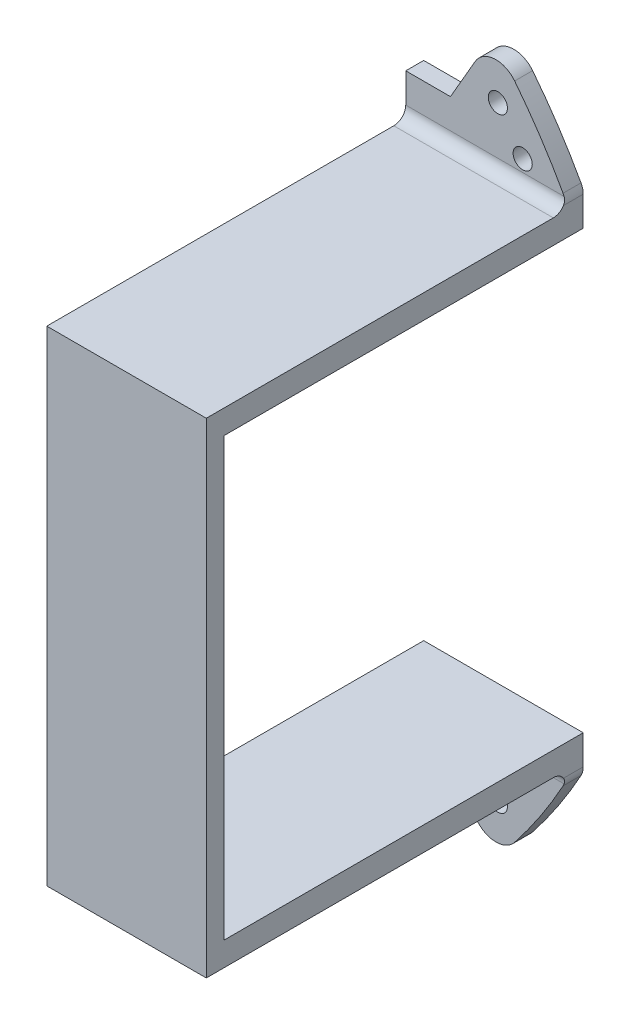
ISO-10303-21;
HEADER;
FILE_DESCRIPTION(('STEP AP214'),'2;1');
FILE_NAME('part.step','',(''),(''),'','','');
FILE_SCHEMA(('AUTOMOTIVE_DESIGN { 1 0 10303 214 1 1 1 1 }'));
ENDSEC;
DATA;
#1=APPLICATION_CONTEXT('core data for automotive mechanical design processes');
#2=APPLICATION_PROTOCOL_DEFINITION('international standard','automotive_design',2000,#1);
#3=PRODUCT_CONTEXT('',#1,'mechanical');
#4=PRODUCT('Part','Part','',(#3));
#5=PRODUCT_RELATED_PRODUCT_CATEGORY('part','',(#4));
#6=PRODUCT_DEFINITION_FORMATION('','',#4);
#7=PRODUCT_DEFINITION_CONTEXT('part definition',#1,'design');
#8=PRODUCT_DEFINITION('design','',#6,#7);
#9=PRODUCT_DEFINITION_SHAPE('','',#8);
#10=(LENGTH_UNIT() NAMED_UNIT(*) SI_UNIT(.MILLI.,.METRE.));
#11=(NAMED_UNIT(*) PLANE_ANGLE_UNIT() SI_UNIT($,.RADIAN.));
#12=(NAMED_UNIT(*) SI_UNIT($,.STERADIAN.) SOLID_ANGLE_UNIT());
#13=UNCERTAINTY_MEASURE_WITH_UNIT(LENGTH_MEASURE(1.E-05),#10,'distance_accuracy_value','');
#14=(GEOMETRIC_REPRESENTATION_CONTEXT(3) GLOBAL_UNCERTAINTY_ASSIGNED_CONTEXT((#13)) GLOBAL_UNIT_ASSIGNED_CONTEXT((#10,
#11,#12)) REPRESENTATION_CONTEXT('',''));
#15=CARTESIAN_POINT('',(0.,0.,0.));
#16=DIRECTION('',(0.,0.,1.));
#17=DIRECTION('',(1.,0.,0.));
#18=AXIS2_PLACEMENT_3D('',#15,#16,#17);
#19=CARTESIAN_POINT('',(0.,0.,60.));
#20=DIRECTION('',(0.,0.,1.));
#21=DIRECTION('',(1.,0.,0.));
#22=AXIS2_PLACEMENT_3D('',#19,#20,#21);
#23=PLANE('',#22);
#24=DIRECTION('',(1.,0.,0.));
#25=VECTOR('',#24,1.);
#26=CARTESIAN_POINT('',(51.6911061384803,36.5132181955899,60.));
#27=LINE('',#26,#25);
#28=CARTESIAN_POINT('',(51.6911061384803,36.5132181955899,60.));
#29=VERTEX_POINT('',#28);
#30=CARTESIAN_POINT('',(78.3533880105422,36.5132181955899,60.));
#31=VERTEX_POINT('',#30);
#32=EDGE_CURVE('E249',#29,#31,#27,.T.);
#33=ORIENTED_EDGE('',*,*,#32,.T.);
#34=DIRECTION('',(0.,1.,0.));
#35=VECTOR('',#34,1.);
#36=CARTESIAN_POINT('',(78.3533880105423,40.5132181955899,60.));
#37=LINE('',#36,#35);
#38=CARTESIAN_POINT('',(78.3533880105422,-36.5132181955899,60.));
#39=VERTEX_POINT('',#38);
#40=EDGE_CURVE('E262',#39,#31,#37,.T.);
#41=ORIENTED_EDGE('',*,*,#40,.F.);
#42=DIRECTION('',(-1.,0.,0.));
#43=VECTOR('',#42,1.);
#44=CARTESIAN_POINT('',(51.6911061384803,-36.5132181955899,60.));
#45=LINE('',#44,#43);
#46=CARTESIAN_POINT('',(51.6911061384803,-36.5132181955899,60.));
#47=VERTEX_POINT('',#46);
#48=EDGE_CURVE('E260',#39,#47,#45,.T.);
#49=ORIENTED_EDGE('',*,*,#48,.T.);
#50=DIRECTION('',(0.,-1.,0.));
#51=VECTOR('',#50,1.);
#52=CARTESIAN_POINT('',(51.6911061384803,40.5132181955899,60.));
#53=LINE('',#52,#51);
#54=EDGE_CURVE('E237',#29,#47,#53,.T.);
#55=ORIENTED_EDGE('',*,*,#54,.F.);
#56=EDGE_LOOP('',(#33,#41,#49,#55));
#57=FACE_BOUND('',#56,.T.);
#58=ADVANCED_FACE('F44',(#57),#23,.F.);
#59=CARTESIAN_POINT('',(66.7536839906342,-52.6207722641848,3.));
#60=DIRECTION('',(0.,0.,-1.));
#61=DIRECTION('',(-1.,0.,0.));
#62=AXIS2_PLACEMENT_3D('',#59,#60,#61);
#63=CYLINDRICAL_SURFACE('',#62,3.99999999999496);
#64=CARTESIAN_POINT('',(66.7536839906342,-52.6207722641848,0.));
#65=DIRECTION('',(0.,0.,1.));
#66=DIRECTION('',(1.,0.,0.));
#67=AXIS2_PLACEMENT_3D('',#64,#65,#66);
#68=CIRCLE('',#67,3.99999999999496);
#69=CARTESIAN_POINT('',(69.8950338254879,-55.0970439001376,0.));
#70=VERTEX_POINT('',#69);
#71=CARTESIAN_POINT('',(63.2895823754973,-54.6207722641762,0.));
#72=VERTEX_POINT('',#71);
#73=EDGE_CURVE('E329',#70,#72,#68,.F.);
#74=ORIENTED_EDGE('',*,*,#73,.F.);
#75=DIRECTION('',(0.,0.,-1.));
#76=VECTOR('',#75,1.);
#77=CARTESIAN_POINT('',(69.8950338254879,-55.0970439001376,3.));
#78=LINE('',#77,#76);
#79=CARTESIAN_POINT('',(69.8950338254879,-55.0970439001376,3.));
#80=VERTEX_POINT('',#79);
#81=EDGE_CURVE('E375',#80,#70,#78,.T.);
#82=ORIENTED_EDGE('',*,*,#81,.F.);
#83=CARTESIAN_POINT('',(66.7536839906342,-52.6207722641848,3.));
#84=DIRECTION('',(0.,0.,1.));
#85=DIRECTION('',(1.,0.,0.));
#86=AXIS2_PLACEMENT_3D('',#83,#84,#85);
#87=CIRCLE('',#86,3.99999999999496);
#88=CARTESIAN_POINT('',(63.2895823754973,-54.6207722641762,3.));
#89=VERTEX_POINT('',#88);
#90=EDGE_CURVE('E302',#80,#89,#87,.F.);
#91=ORIENTED_EDGE('',*,*,#90,.T.);
#92=DIRECTION('',(0.,0.,-1.));
#93=VECTOR('',#92,1.);
#94=CARTESIAN_POINT('',(63.2895823754973,-54.6207722641762,3.));
#95=LINE('',#94,#93);
#96=EDGE_CURVE('E322',#89,#72,#95,.T.);
#97=ORIENTED_EDGE('',*,*,#96,.T.);
#98=EDGE_LOOP('',(#74,#82,#91,#97));
#99=FACE_BOUND('',#98,.T.);
#100=ADVANCED_FACE('F424',(#99),#63,.T.);
#101=CARTESIAN_POINT('',(-1.52386436802487E-09,1.01026825793937E-09,3.));
#102=DIRECTION('',(0.,0.,-1.));
#103=DIRECTION('',(-1.,0.,0.));
#104=AXIS2_PLACEMENT_3D('',#101,#102,#103);
#105=CYLINDRICAL_SURFACE('',#104,89.0000000018209);
#106=CARTESIAN_POINT('',(-1.52386436802487E-09,1.01026825793937E-09,0.));
#107=DIRECTION('',(0.,0.,1.));
#108=DIRECTION('',(1.,0.,0.));
#109=AXIS2_PLACEMENT_3D('',#106,#107,#108);
#110=CIRCLE('',#109,89.0000000018209);
#111=CARTESIAN_POINT('',(77.981994569049,-42.8929892060755,0.));
#112=VERTEX_POINT('',#111);
#113=EDGE_CURVE('E332',#112,#70,#110,.F.);
#114=ORIENTED_EDGE('',*,*,#113,.F.);
#115=DIRECTION('',(0.,0.,-1.));
#116=VECTOR('',#115,1.);
#117=CARTESIAN_POINT('',(77.981994569049,-42.8929892060755,3.));
#118=LINE('',#117,#116);
#119=CARTESIAN_POINT('',(77.981994569049,-42.8929892060755,3.));
#120=VERTEX_POINT('',#119);
#121=EDGE_CURVE('E372',#120,#112,#118,.T.);
#122=ORIENTED_EDGE('',*,*,#121,.F.);
#123=CARTESIAN_POINT('',(-1.52386436802487E-09,1.01026825793937E-09,3.));
#124=DIRECTION('',(0.,0.,1.));
#125=DIRECTION('',(1.,0.,0.));
#126=AXIS2_PLACEMENT_3D('',#123,#124,#125);
#127=CIRCLE('',#126,89.0000000018209);
#128=EDGE_CURVE('E305',#120,#80,#127,.F.);
#129=ORIENTED_EDGE('',*,*,#128,.T.);
#130=ORIENTED_EDGE('',*,*,#81,.T.);
#131=EDGE_LOOP('',(#114,#122,#129,#130));
#132=FACE_BOUND('',#131,.T.);
#133=ADVANCED_FACE('F427',(#132),#105,.T.);
#134=CARTESIAN_POINT('',(75.3533880105548,-41.4471581092429,3.));
#135=DIRECTION('',(0.,0.,-1.));
#136=DIRECTION('',(-1.,0.,0.));
#137=AXIS2_PLACEMENT_3D('',#134,#135,#136);
#138=CYLINDRICAL_SURFACE('',#137,2.9999999999879);
#139=CARTESIAN_POINT('',(75.3533880105548,-41.4471581092429,0.));
#140=DIRECTION('',(0.,0.,1.));
#141=DIRECTION('',(1.,0.,0.));
#142=AXIS2_PLACEMENT_3D('',#139,#140,#141);
#143=CIRCLE('',#142,2.9999999999879);
#144=CARTESIAN_POINT('',(78.3533880105422,-41.4471581092417,0.));
#145=VERTEX_POINT('',#144);
#146=EDGE_CURVE('E336',#145,#112,#143,.F.);
#147=ORIENTED_EDGE('',*,*,#146,.F.);
#148=DIRECTION('',(0.,0.,-1.));
#149=VECTOR('',#148,1.);
#150=CARTESIAN_POINT('',(78.3533880105422,-41.4471581092417,3.));
#151=LINE('',#150,#149);
#152=CARTESIAN_POINT('',(78.3533880105422,-41.4471581092417,3.3078073713979));
#153=VERTEX_POINT('',#152);
#154=EDGE_CURVE('E64',#153,#145,#151,.T.);
#155=ORIENTED_EDGE('',*,*,#154,.F.);
#156=CARTESIAN_POINT('',(78.3533880105422,-41.4471581092417,3.3078073713979));
#157=CARTESIAN_POINT('',(78.3533942109434,-41.4891067031482,3.28137080454512));
#158=CARTESIAN_POINT('',(78.3525082251359,-41.5320520285226,3.25650450454342));
#159=CARTESIAN_POINT('',(78.3487462979007,-41.6196112091308,3.21005162034143));
#160=CARTESIAN_POINT('',(78.3458698154255,-41.6642255148992,3.18846592980714));
#161=CARTESIAN_POINT('',(78.3380309431686,-41.7535230797021,3.14927719438021));
#162=CARTESIAN_POINT('',(78.3331284091843,-41.7981703446325,3.13158055528396));
#163=CARTESIAN_POINT('',(78.3211213119526,-41.8883305648465,3.09952399608123));
#164=CARTESIAN_POINT('',(78.3140172507302,-41.9338433205492,3.08516331656467));
#165=CARTESIAN_POINT('',(78.2899564086292,-42.0671884003579,3.04826309777307));
#166=CARTESIAN_POINT('',(78.269920703359,-42.1557874987048,3.03019720733847));
#167=CARTESIAN_POINT('',(78.2331700793004,-42.2892289744929,3.01205238232123));
#168=CARTESIAN_POINT('',(78.219572854431,-42.3344123514865,3.00749889830598));
#169=CARTESIAN_POINT('',(78.1901989614402,-42.4242640696605,3.00147308857139));
#170=CARTESIAN_POINT('',(78.1744227597516,-42.4689325188555,3.00000010452535));
#171=CARTESIAN_POINT('',(78.1575841328375,-42.5132181955899,3.));
#172=B_SPLINE_CURVE_WITH_KNOTS('',3,(#156,#157,#158,#159,#160,#161,#162,#163,#164,#165,#166,
#167,#168,#169,#170,#171),.UNSPECIFIED.,.F.,.F.,(4,2,2,2,2,2,2,4),(0.,0.148718217043229,
0.297476873861878,0.442123591314391,0.586737348518171,0.863145364514833,1.00523204345004,
1.14728835425767),.UNSPECIFIED.);
#173=CARTESIAN_POINT('',(78.1575841328375,-42.5132181955899,3.));
#174=VERTEX_POINT('',#173);
#175=EDGE_CURVE('E54',#153,#174,#172,.T.);
#176=ORIENTED_EDGE('',*,*,#175,.T.);
#177=CARTESIAN_POINT('',(75.3533880105548,-41.4471581092429,3.));
#178=DIRECTION('',(0.,0.,1.));
#179=DIRECTION('',(1.,0.,0.));
#180=AXIS2_PLACEMENT_3D('',#177,#178,#179);
#181=CIRCLE('',#180,2.9999999999879);
#182=EDGE_CURVE('E309',#174,#120,#181,.F.);
#183=ORIENTED_EDGE('',*,*,#182,.T.);
#184=ORIENTED_EDGE('',*,*,#121,.T.);
#185=EDGE_LOOP('',(#147,#155,#176,#183,#184));
#186=FACE_BOUND('',#185,.T.);
#187=ADVANCED_FACE('F431',(#186),#138,.T.);
#188=CARTESIAN_POINT('',(78.3533880105431,-1.76308866644282E-12,3.));
#189=DIRECTION('',(1.,0.,0.));
#190=DIRECTION('',(0.,1.,0.));
#191=AXIS2_PLACEMENT_3D('',#188,#189,#190);
#192=PLANE('',#191);
#193=DIRECTION('',(0.,-1.,0.));
#194=VECTOR('',#193,1.);
#195=CARTESIAN_POINT('',(78.3533880105431,-1.76308866644282E-12,0.));
#196=LINE('',#195,#194);
#197=CARTESIAN_POINT('',(78.3533880105423,-36.5132181955899,0.));
#198=VERTEX_POINT('',#197);
#199=EDGE_CURVE('E340',#198,#145,#196,.T.);
#200=ORIENTED_EDGE('',*,*,#199,.F.);
#201=DIRECTION('',(0.,0.,-1.));
#202=VECTOR('',#201,1.);
#203=CARTESIAN_POINT('',(78.3533880105423,-36.5132181955899,3.));
#204=LINE('',#203,#202);
#205=EDGE_CURVE('E367',#39,#198,#204,.T.);
#206=ORIENTED_EDGE('',*,*,#205,.F.);
#207=ORIENTED_EDGE('',*,*,#40,.T.);
#208=DIRECTION('',(0.,0.,-1.));
#209=VECTOR('',#208,1.);
#210=CARTESIAN_POINT('',(78.3533880105423,36.5132181955899,3.));
#211=LINE('',#210,#209);
#212=CARTESIAN_POINT('',(78.3533880105423,36.5132181955899,0.));
#213=VERTEX_POINT('',#212);
#214=EDGE_CURVE('E246',#31,#213,#211,.T.);
#215=ORIENTED_EDGE('',*,*,#214,.T.);
#216=DIRECTION('',(0.,1.,0.));
#217=VECTOR('',#216,1.);
#218=CARTESIAN_POINT('',(78.3533880105431,1.76308866644282E-12,0.));
#219=LINE('',#218,#217);
#220=CARTESIAN_POINT('',(78.3533880105422,41.4471581092417,0.));
#221=VERTEX_POINT('',#220);
#222=EDGE_CURVE('E487',#213,#221,#219,.T.);
#223=ORIENTED_EDGE('',*,*,#222,.T.);
#224=DIRECTION('',(0.,0.,-1.));
#225=VECTOR('',#224,1.);
#226=CARTESIAN_POINT('',(78.3533880105422,41.4471581092417,3.));
#227=LINE('',#226,#225);
#228=CARTESIAN_POINT('',(78.3533880105422,41.4471581092417,3.3078073713979));
#229=VERTEX_POINT('',#228);
#230=EDGE_CURVE('E75',#229,#221,#227,.T.);
#231=ORIENTED_EDGE('',*,*,#230,.F.);
#232=CARTESIAN_POINT('',(78.3533880105441,42.5132181955899,5.));
#233=DIRECTION('',(1.,0.,0.));
#234=DIRECTION('',(0.,1.,0.));
#235=AXIS2_PLACEMENT_3D('',#232,#233,#234);
#236=CIRCLE('',#235,2.);
#237=CARTESIAN_POINT('',(78.3533880105423,40.5132181955899,5.));
#238=VERTEX_POINT('',#237);
#239=EDGE_CURVE('E402',#229,#238,#236,.F.);
#240=ORIENTED_EDGE('',*,*,#239,.T.);
#241=DIRECTION('',(0.,0.,-1.));
#242=VECTOR('',#241,1.);
#243=CARTESIAN_POINT('',(78.3533880105423,40.5132181955899,63.));
#244=LINE('',#243,#242);
#245=CARTESIAN_POINT('',(78.3533880105423,40.5132181955899,63.));
#246=VERTEX_POINT('',#245);
#247=EDGE_CURVE('E280',#246,#238,#244,.T.);
#248=ORIENTED_EDGE('',*,*,#247,.F.);
#249=DIRECTION('',(0.,1.,0.));
#250=VECTOR('',#249,1.);
#251=CARTESIAN_POINT('',(78.3533880105423,40.5132181955899,63.));
#252=LINE('',#251,#250);
#253=CARTESIAN_POINT('',(78.3533880105423,-40.5132181955899,63.));
#254=VERTEX_POINT('',#253);
#255=EDGE_CURVE('E532',#254,#246,#252,.T.);
#256=ORIENTED_EDGE('',*,*,#255,.F.);
#257=DIRECTION('',(0.,0.,-1.));
#258=VECTOR('',#257,1.);
#259=CARTESIAN_POINT('',(78.3533880105423,-40.5132181955899,60.));
#260=LINE('',#259,#258);
#261=CARTESIAN_POINT('',(78.3533880105423,-40.5132181955899,5.));
#262=VERTEX_POINT('',#261);
#263=EDGE_CURVE('E285',#254,#262,#260,.T.);
#264=ORIENTED_EDGE('',*,*,#263,.T.);
#265=CARTESIAN_POINT('',(78.3533880105421,-42.5132181955899,5.));
#266=DIRECTION('',(1.,0.,0.));
#267=DIRECTION('',(0.,1.,0.));
#268=AXIS2_PLACEMENT_3D('',#265,#266,#267);
#269=CIRCLE('',#268,2.);
#270=EDGE_CURVE('E443',#262,#153,#269,.F.);
#271=ORIENTED_EDGE('',*,*,#270,.T.);
#272=ORIENTED_EDGE('',*,*,#154,.T.);
#273=EDGE_LOOP('',(#200,#206,#207,#215,#223,#231,#240,#248,#256,#264,#271,#272));
#274=FACE_BOUND('',#273,.T.);
#275=ADVANCED_FACE('F436',(#274),#192,.T.);
#276=CARTESIAN_POINT('',(0.,-36.5132181955899,3.));
#277=DIRECTION('',(0.,1.,0.));
#278=DIRECTION('',(0.,0.,1.));
#279=AXIS2_PLACEMENT_3D('',#276,#277,#278);
#280=PLANE('',#279);
#281=DIRECTION('',(1.,0.,0.));
#282=VECTOR('',#281,1.);
#283=CARTESIAN_POINT('',(0.,-36.5132181955899,0.));
#284=LINE('',#283,#282);
#285=CARTESIAN_POINT('',(51.6911061384803,-36.5132181955899,0.));
#286=VERTEX_POINT('',#285);
#287=EDGE_CURVE('E344',#286,#198,#284,.T.);
#288=ORIENTED_EDGE('',*,*,#287,.F.);
#289=DIRECTION('',(0.,0.,-1.));
#290=VECTOR('',#289,1.);
#291=CARTESIAN_POINT('',(51.6911061384803,-36.5132181955899,3.));
#292=LINE('',#291,#290);
#293=EDGE_CURVE('E364',#47,#286,#292,.T.);
#294=ORIENTED_EDGE('',*,*,#293,.F.);
#295=ORIENTED_EDGE('',*,*,#48,.F.);
#296=ORIENTED_EDGE('',*,*,#205,.T.);
#297=EDGE_LOOP('',(#288,#294,#295,#296));
#298=FACE_BOUND('',#297,.T.);
#299=ADVANCED_FACE('F558',(#298),#280,.T.);
#300=CARTESIAN_POINT('',(51.6911061384803,0.,3.));
#301=DIRECTION('',(-1.,0.,0.));
#302=DIRECTION('',(0.,0.,1.));
#303=AXIS2_PLACEMENT_3D('',#300,#301,#302);
#304=PLANE('',#303);
#305=DIRECTION('',(0.,1.,0.));
#306=VECTOR('',#305,1.);
#307=CARTESIAN_POINT('',(51.6911061384803,0.,0.));
#308=LINE('',#307,#306);
#309=CARTESIAN_POINT('',(51.6911061384803,-47.4698544762637,0.));
#310=VERTEX_POINT('',#309);
#311=EDGE_CURVE('E348',#310,#286,#308,.T.);
#312=ORIENTED_EDGE('',*,*,#311,.F.);
#313=DIRECTION('',(0.,0.,-1.));
#314=VECTOR('',#313,1.);
#315=CARTESIAN_POINT('',(51.6911061384803,-47.4698544762637,3.));
#316=LINE('',#315,#314);
#317=CARTESIAN_POINT('',(51.6911061384803,-47.4698544762637,3.));
#318=VERTEX_POINT('',#317);
#319=EDGE_CURVE('E361',#318,#310,#316,.T.);
#320=ORIENTED_EDGE('',*,*,#319,.F.);
#321=DIRECTION('',(0.,1.,0.));
#322=VECTOR('',#321,1.);
#323=CARTESIAN_POINT('',(51.6911061384803,0.,3.));
#324=LINE('',#323,#322);
#325=CARTESIAN_POINT('',(51.6911061384803,-42.5132181955899,3.));
#326=VERTEX_POINT('',#325);
#327=EDGE_CURVE('E312',#318,#326,#324,.T.);
#328=ORIENTED_EDGE('',*,*,#327,.T.);
#329=CARTESIAN_POINT('',(51.6911061384803,-42.5132181955899,5.));
#330=DIRECTION('',(-1.,0.,0.));
#331=DIRECTION('',(0.,0.,1.));
#332=AXIS2_PLACEMENT_3D('',#329,#330,#331);
#333=CIRCLE('',#332,2.);
#334=CARTESIAN_POINT('',(51.6911061384803,-40.5132181955899,5.));
#335=VERTEX_POINT('',#334);
#336=EDGE_CURVE('E11',#326,#335,#333,.F.);
#337=ORIENTED_EDGE('',*,*,#336,.T.);
#338=DIRECTION('',(0.,0.,-1.));
#339=VECTOR('',#338,1.);
#340=CARTESIAN_POINT('',(51.6911061384803,-40.5132181955899,60.));
#341=LINE('',#340,#339);
#342=CARTESIAN_POINT('',(51.6911061384803,-40.5132181955899,63.));
#343=VERTEX_POINT('',#342);
#344=EDGE_CURVE('E289',#343,#335,#341,.T.);
#345=ORIENTED_EDGE('',*,*,#344,.F.);
#346=DIRECTION('',(0.,-1.,0.));
#347=VECTOR('',#346,1.);
#348=CARTESIAN_POINT('',(51.6911061384803,40.5132181955899,63.));
#349=LINE('',#348,#347);
#350=CARTESIAN_POINT('',(51.6911061384803,40.5132181955899,63.));
#351=VERTEX_POINT('',#350);
#352=EDGE_CURVE('E267',#351,#343,#349,.T.);
#353=ORIENTED_EDGE('',*,*,#352,.F.);
#354=DIRECTION('',(0.,0.,-1.));
#355=VECTOR('',#354,1.);
#356=CARTESIAN_POINT('',(51.6911061384803,40.5132181955899,63.));
#357=LINE('',#356,#355);
#358=CARTESIAN_POINT('',(51.6911061384803,40.5132181955899,5.));
#359=VERTEX_POINT('',#358);
#360=EDGE_CURVE('E276',#351,#359,#357,.T.);
#361=ORIENTED_EDGE('',*,*,#360,.T.);
#362=CARTESIAN_POINT('',(51.6911061384803,42.5132181955899,5.));
#363=DIRECTION('',(-1.,0.,0.));
#364=DIRECTION('',(0.,0.,1.));
#365=AXIS2_PLACEMENT_3D('',#362,#363,#364);
#366=CIRCLE('',#365,2.);
#367=CARTESIAN_POINT('',(51.6911061384803,42.5132181955899,3.));
#368=VERTEX_POINT('',#367);
#369=EDGE_CURVE('E391',#359,#368,#366,.F.);
#370=ORIENTED_EDGE('',*,*,#369,.T.);
#371=DIRECTION('',(0.,-1.,0.));
#372=VECTOR('',#371,1.);
#373=CARTESIAN_POINT('',(51.6911061384803,0.,3.));
#374=LINE('',#373,#372);
#375=CARTESIAN_POINT('',(51.6911061384803,47.4698544762637,3.));
#376=VERTEX_POINT('',#375);
#377=EDGE_CURVE('E460',#376,#368,#374,.T.);
#378=ORIENTED_EDGE('',*,*,#377,.F.);
#379=DIRECTION('',(0.,0.,-1.));
#380=VECTOR('',#379,1.);
#381=CARTESIAN_POINT('',(51.6911061384803,47.4698544762637,3.));
#382=LINE('',#381,#380);
#383=CARTESIAN_POINT('',(51.6911061384803,47.4698544762637,0.));
#384=VERTEX_POINT('',#383);
#385=EDGE_CURVE('E245',#376,#384,#382,.T.);
#386=ORIENTED_EDGE('',*,*,#385,.T.);
#387=DIRECTION('',(0.,-1.,0.));
#388=VECTOR('',#387,1.);
#389=CARTESIAN_POINT('',(51.6911061384803,0.,0.));
#390=LINE('',#389,#388);
#391=CARTESIAN_POINT('',(51.6911061384803,36.5132181955899,0.));
#392=VERTEX_POINT('',#391);
#393=EDGE_CURVE('E241',#384,#392,#390,.T.);
#394=ORIENTED_EDGE('',*,*,#393,.T.);
#395=DIRECTION('',(0.,0.,-1.));
#396=VECTOR('',#395,1.);
#397=CARTESIAN_POINT('',(51.6911061384803,36.5132181955899,3.));
#398=LINE('',#397,#396);
#399=EDGE_CURVE('E232',#29,#392,#398,.T.);
#400=ORIENTED_EDGE('',*,*,#399,.F.);
#401=ORIENTED_EDGE('',*,*,#54,.T.);
#402=ORIENTED_EDGE('',*,*,#293,.T.);
#403=EDGE_LOOP('',(#312,#320,#328,#337,#345,#353,#361,#370,#378,#386,#394,#400,#401,#402));
#404=FACE_BOUND('',#403,.T.);
#405=ADVANCED_FACE('F235',(#404),#304,.T.);
#406=CARTESIAN_POINT('',(0.,-47.4698544762637,3.));
#407=DIRECTION('',(0.,-1.,0.));
#408=DIRECTION('',(0.,0.,-1.));
#409=AXIS2_PLACEMENT_3D('',#406,#407,#408);
#410=PLANE('',#409);
#411=DIRECTION('',(-1.,0.,0.));
#412=VECTOR('',#411,1.);
#413=CARTESIAN_POINT('',(0.,-47.4698544762637,0.));
#414=LINE('',#413,#412);
#415=CARTESIAN_POINT('',(59.1609980656931,-47.4698544762637,0.));
#416=VERTEX_POINT('',#415);
#417=EDGE_CURVE('E352',#416,#310,#414,.T.);
#418=ORIENTED_EDGE('',*,*,#417,.F.);
#419=DIRECTION('',(0.,0.,-1.));
#420=VECTOR('',#419,1.);
#421=CARTESIAN_POINT('',(59.1609980656931,-47.4698544762637,3.));
#422=LINE('',#421,#420);
#423=CARTESIAN_POINT('',(59.1609980656931,-47.4698544762637,3.));
#424=VERTEX_POINT('',#423);
#425=EDGE_CURVE('E359',#424,#416,#422,.T.);
#426=ORIENTED_EDGE('',*,*,#425,.F.);
#427=DIRECTION('',(-1.,0.,0.));
#428=VECTOR('',#427,1.);
#429=CARTESIAN_POINT('',(0.,-47.4698544762637,3.));
#430=LINE('',#429,#428);
#431=EDGE_CURVE('E316',#424,#318,#430,.T.);
#432=ORIENTED_EDGE('',*,*,#431,.T.);
#433=ORIENTED_EDGE('',*,*,#319,.T.);
#434=EDGE_LOOP('',(#418,#426,#432,#433));
#435=FACE_BOUND('',#434,.T.);
#436=ADVANCED_FACE('F422',(#435),#410,.T.);
#437=CARTESIAN_POINT('',(71.2360400771394,-44.5132181955899,3.));
#438=DIRECTION('',(0.,0.,-1.));
#439=DIRECTION('',(-1.,0.,0.));
#440=AXIS2_PLACEMENT_3D('',#437,#438,#439);
#441=CYLINDRICAL_SURFACE('',#440,1.59999999999999);
#442=CARTESIAN_POINT('',(71.2360400771394,-44.5132181955899,3.));
#443=DIRECTION('',(0.,0.,1.));
#444=DIRECTION('',(1.,0.,0.));
#445=AXIS2_PLACEMENT_3D('',#442,#443,#444);
#446=CIRCLE('',#445,1.59999999999999);
#447=CARTESIAN_POINT('',(72.8360400771394,-44.5132181955899,3.));
#448=VERTEX_POINT('',#447);
#449=EDGE_CURVE('E297',#448,#448,#446,.T.);
#450=ORIENTED_EDGE('',*,*,#449,.T.);
#451=EDGE_LOOP('',(#450));
#452=FACE_BOUND('',#451,.T.);
#453=CARTESIAN_POINT('',(71.2360400771394,-44.5132181955899,0.));
#454=DIRECTION('',(0.,0.,1.));
#455=DIRECTION('',(1.,0.,0.));
#456=AXIS2_PLACEMENT_3D('',#453,#454,#455);
#457=CIRCLE('',#456,1.59999999999999);
#458=CARTESIAN_POINT('',(72.8360400771394,-44.5132181955899,0.));
#459=VERTEX_POINT('',#458);
#460=EDGE_CURVE('E325',#459,#459,#457,.T.);
#461=ORIENTED_EDGE('',*,*,#460,.F.);
#462=EDGE_LOOP('',(#461));
#463=FACE_BOUND('',#462,.T.);
#464=ADVANCED_FACE('F418',(#452,#463),#441,.F.);
#465=CARTESIAN_POINT('',(67.0853828439722,-50.5524619447728,3.));
#466=DIRECTION('',(0.,0.,-1.));
#467=DIRECTION('',(-1.,0.,0.));
#468=AXIS2_PLACEMENT_3D('',#465,#466,#467);
#469=CYLINDRICAL_SURFACE('',#468,1.59999999999998);
#470=CARTESIAN_POINT('',(67.0853828439722,-50.5524619447728,3.));
#471=DIRECTION('',(0.,0.,1.));
#472=DIRECTION('',(1.,0.,0.));
#473=AXIS2_PLACEMENT_3D('',#470,#471,#472);
#474=CIRCLE('',#473,1.59999999999998);
#475=CARTESIAN_POINT('',(68.6853828439722,-50.5524619447728,3.));
#476=VERTEX_POINT('',#475);
#477=EDGE_CURVE('E294',#476,#476,#474,.T.);
#478=ORIENTED_EDGE('',*,*,#477,.T.);
#479=EDGE_LOOP('',(#478));
#480=FACE_BOUND('',#479,.T.);
#481=CARTESIAN_POINT('',(67.0853828439722,-50.5524619447728,0.));
#482=DIRECTION('',(0.,0.,1.));
#483=DIRECTION('',(1.,0.,0.));
#484=AXIS2_PLACEMENT_3D('',#481,#482,#483);
#485=CIRCLE('',#484,1.59999999999998);
#486=CARTESIAN_POINT('',(68.6853828439722,-50.5524619447728,0.));
#487=VERTEX_POINT('',#486);
#488=EDGE_CURVE('E293',#487,#487,#485,.T.);
#489=ORIENTED_EDGE('',*,*,#488,.F.);
#490=EDGE_LOOP('',(#489));
#491=FACE_BOUND('',#490,.T.);
#492=ADVANCED_FACE('F414',(#480,#491),#469,.F.);
#493=CARTESIAN_POINT('',(23.8156986040725,13.7500000000002,3.));
#494=DIRECTION('',(0.866025403784439,0.499999999999999,0.));
#495=DIRECTION('',(-0.499999999999999,0.866025403784439,0.));
#496=AXIS2_PLACEMENT_3D('',#493,#494,#495);
#497=PLANE('',#496);
#498=DIRECTION('',(0.499999999999999,-0.866025403784439,0.));
#499=VECTOR('',#498,1.);
#500=CARTESIAN_POINT('',(23.8156986040725,13.7500000000002,0.));
#501=LINE('',#500,#499);
#502=EDGE_CURVE('E298',#416,#72,#501,.T.);
#503=ORIENTED_EDGE('',*,*,#502,.T.);
#504=ORIENTED_EDGE('',*,*,#96,.F.);
#505=DIRECTION('',(0.499999999999999,-0.866025403784439,0.));
#506=VECTOR('',#505,1.);
#507=CARTESIAN_POINT('',(23.8156986040725,13.7500000000002,3.));
#508=LINE('',#507,#506);
#509=EDGE_CURVE('E320',#424,#89,#508,.T.);
#510=ORIENTED_EDGE('',*,*,#509,.F.);
#511=ORIENTED_EDGE('',*,*,#425,.T.);
#512=EDGE_LOOP('',(#503,#504,#510,#511));
#513=FACE_BOUND('',#512,.T.);
#514=ADVANCED_FACE('F417',(#513),#497,.F.);
#515=CARTESIAN_POINT('',(0.,0.,3.));
#516=DIRECTION('',(0.,0.,1.));
#517=DIRECTION('',(1.,0.,0.));
#518=AXIS2_PLACEMENT_3D('',#515,#516,#517);
#519=PLANE('',#518);
#520=ORIENTED_EDGE('',*,*,#182,.F.);
#521=DIRECTION('',(1.,0.,0.));
#522=VECTOR('',#521,1.);
#523=CARTESIAN_POINT('',(0.,-42.5132181955899,3.));
#524=LINE('',#523,#522);
#525=EDGE_CURVE('E388',#174,#326,#524,.F.);
#526=ORIENTED_EDGE('',*,*,#525,.T.);
#527=ORIENTED_EDGE('',*,*,#327,.F.);
#528=ORIENTED_EDGE('',*,*,#431,.F.);
#529=ORIENTED_EDGE('',*,*,#509,.T.);
#530=ORIENTED_EDGE('',*,*,#90,.F.);
#531=ORIENTED_EDGE('',*,*,#128,.F.);
#532=EDGE_LOOP('',(#520,#526,#527,#528,#529,#530,#531));
#533=FACE_BOUND('',#532,.T.);
#534=ORIENTED_EDGE('',*,*,#477,.F.);
#535=EDGE_LOOP('',(#534));
#536=FACE_BOUND('',#535,.T.);
#537=ORIENTED_EDGE('',*,*,#449,.F.);
#538=EDGE_LOOP('',(#537));
#539=FACE_BOUND('',#538,.T.);
#540=ADVANCED_FACE('F548',(#533,#536,#539),#519,.T.);
#541=CARTESIAN_POINT('',(0.,0.,0.));
#542=DIRECTION('',(0.,0.,1.));
#543=DIRECTION('',(1.,0.,0.));
#544=AXIS2_PLACEMENT_3D('',#541,#542,#543);
#545=PLANE('',#544);
#546=ORIENTED_EDGE('',*,*,#488,.T.);
#547=EDGE_LOOP('',(#546));
#548=FACE_BOUND('',#547,.T.);
#549=ORIENTED_EDGE('',*,*,#460,.T.);
#550=EDGE_LOOP('',(#549));
#551=FACE_BOUND('',#550,.T.);
#552=ORIENTED_EDGE('',*,*,#73,.T.);
#553=ORIENTED_EDGE('',*,*,#502,.F.);
#554=ORIENTED_EDGE('',*,*,#417,.T.);
#555=ORIENTED_EDGE('',*,*,#311,.T.);
#556=ORIENTED_EDGE('',*,*,#287,.T.);
#557=ORIENTED_EDGE('',*,*,#199,.T.);
#558=ORIENTED_EDGE('',*,*,#146,.T.);
#559=ORIENTED_EDGE('',*,*,#113,.T.);
#560=EDGE_LOOP('',(#552,#553,#554,#555,#556,#557,#558,#559));
#561=FACE_BOUND('',#560,.T.);
#562=ADVANCED_FACE('F555',(#548,#551,#561),#545,.F.);
#563=CARTESIAN_POINT('',(51.6911061384803,-40.5132181955899,60.));
#564=DIRECTION('',(0.,1.,0.));
#565=DIRECTION('',(0.,0.,1.));
#566=AXIS2_PLACEMENT_3D('',#563,#564,#565);
#567=PLANE('',#566);
#568=ORIENTED_EDGE('',*,*,#344,.T.);
#569=DIRECTION('',(1.,0.,0.));
#570=VECTOR('',#569,1.);
#571=CARTESIAN_POINT('',(51.6911061384803,-40.5132181955899,5.));
#572=LINE('',#571,#570);
#573=EDGE_CURVE('E384',#335,#262,#572,.T.);
#574=ORIENTED_EDGE('',*,*,#573,.T.);
#575=ORIENTED_EDGE('',*,*,#263,.F.);
#576=DIRECTION('',(1.,0.,0.));
#577=VECTOR('',#576,1.);
#578=CARTESIAN_POINT('',(51.6911061384803,-40.5132181955899,63.));
#579=LINE('',#578,#577);
#580=EDGE_CURVE('E529',#343,#254,#579,.T.);
#581=ORIENTED_EDGE('',*,*,#580,.F.);
#582=EDGE_LOOP('',(#568,#574,#575,#581));
#583=FACE_BOUND('',#582,.T.);
#584=ADVANCED_FACE('F541',(#583),#567,.F.);
#585=CARTESIAN_POINT('',(51.6911061384803,40.5132181955899,63.));
#586=DIRECTION('',(0.,-1.,0.));
#587=DIRECTION('',(0.,0.,-1.));
#588=AXIS2_PLACEMENT_3D('',#585,#586,#587);
#589=PLANE('',#588);
#590=ORIENTED_EDGE('',*,*,#247,.T.);
#591=DIRECTION('',(-1.,0.,0.));
#592=VECTOR('',#591,1.);
#593=CARTESIAN_POINT('',(51.6911061384803,40.5132181955899,5.));
#594=LINE('',#593,#592);
#595=EDGE_CURVE('E377',#238,#359,#594,.T.);
#596=ORIENTED_EDGE('',*,*,#595,.T.);
#597=ORIENTED_EDGE('',*,*,#360,.F.);
#598=DIRECTION('',(-1.,0.,0.));
#599=VECTOR('',#598,1.);
#600=CARTESIAN_POINT('',(51.6911061384803,40.5132181955899,63.));
#601=LINE('',#600,#599);
#602=EDGE_CURVE('E273',#246,#351,#601,.T.);
#603=ORIENTED_EDGE('',*,*,#602,.F.);
#604=EDGE_LOOP('',(#590,#596,#597,#603));
#605=FACE_BOUND('',#604,.T.);
#606=ADVANCED_FACE('F455',(#605),#589,.F.);
#607=CARTESIAN_POINT('',(0.,0.,63.));
#608=DIRECTION('',(0.,0.,1.));
#609=DIRECTION('',(1.,0.,0.));
#610=AXIS2_PLACEMENT_3D('',#607,#608,#609);
#611=PLANE('',#610);
#612=ORIENTED_EDGE('',*,*,#352,.T.);
#613=ORIENTED_EDGE('',*,*,#580,.T.);
#614=ORIENTED_EDGE('',*,*,#255,.T.);
#615=ORIENTED_EDGE('',*,*,#602,.T.);
#616=EDGE_LOOP('',(#612,#613,#614,#615));
#617=FACE_BOUND('',#616,.T.);
#618=ADVANCED_FACE('F536',(#617),#611,.T.);
#619=CARTESIAN_POINT('',(75.3533880105548,41.4471581092429,3.));
#620=DIRECTION('',(0.,0.,-1.));
#621=DIRECTION('',(-1.,0.,0.));
#622=AXIS2_PLACEMENT_3D('',#619,#620,#621);
#623=CYLINDRICAL_SURFACE('',#622,2.9999999999879);
#624=CARTESIAN_POINT('',(75.3533880105548,41.4471581092429,0.));
#625=DIRECTION('',(0.,0.,1.));
#626=DIRECTION('',(1.,0.,0.));
#627=AXIS2_PLACEMENT_3D('',#624,#625,#626);
#628=CIRCLE('',#627,2.9999999999879);
#629=CARTESIAN_POINT('',(77.9819945689281,42.892989206009,0.));
#630=VERTEX_POINT('',#629);
#631=EDGE_CURVE('E490',#221,#630,#628,.T.);
#632=ORIENTED_EDGE('',*,*,#631,.T.);
#633=DIRECTION('',(0.,0.,-1.));
#634=VECTOR('',#633,1.);
#635=CARTESIAN_POINT('',(77.9819945689281,42.892989206009,3.));
#636=LINE('',#635,#634);
#637=CARTESIAN_POINT('',(77.9819945689281,42.892989206009,3.));
#638=VERTEX_POINT('',#637);
#639=EDGE_CURVE('E270',#638,#630,#636,.T.);
#640=ORIENTED_EDGE('',*,*,#639,.F.);
#641=CARTESIAN_POINT('',(75.3533880105548,41.4471581092429,3.));
#642=DIRECTION('',(0.,0.,1.));
#643=DIRECTION('',(1.,0.,0.));
#644=AXIS2_PLACEMENT_3D('',#641,#642,#643);
#645=CIRCLE('',#644,2.9999999999879);
#646=CARTESIAN_POINT('',(78.1575841328375,42.5132181955899,3.));
#647=VERTEX_POINT('',#646);
#648=EDGE_CURVE('E799',#647,#638,#645,.T.);
#649=ORIENTED_EDGE('',*,*,#648,.F.);
#650=CARTESIAN_POINT('',(78.1575841328375,42.5132181955899,3.));
#651=CARTESIAN_POINT('',(78.1752119604617,42.4668759539024,2.99999208611385));
#652=CARTESIAN_POINT('',(78.1916762684149,42.420082742036,3.00161080563459));
#653=CARTESIAN_POINT('',(78.2222147303398,42.3259458255722,3.00822986795225));
#654=CARTESIAN_POINT('',(78.2362882297134,42.2786019739899,3.01323113502209));
#655=CARTESIAN_POINT('',(78.2616174858475,42.1850512363936,3.02655714807391));
#656=CARTESIAN_POINT('',(78.2729403430531,42.1388490719868,3.03478626563737));
#657=CARTESIAN_POINT('',(78.2932529146541,42.0466796173888,3.05460326604732));
#658=CARTESIAN_POINT('',(78.3022431576104,42.0007122763059,3.06619038672204));
#659=CARTESIAN_POINT('',(78.3250876276456,41.867658917477,3.1048755748679));
#660=CARTESIAN_POINT('',(78.3359071953194,41.7812799211592,3.13648550246934));
#661=CARTESIAN_POINT('',(78.3465519490549,41.6541931479906,3.19325554487959));
#662=CARTESIAN_POINT('',(78.3491648411934,41.6116895484862,3.21408538777278));
#663=CARTESIAN_POINT('',(78.3525828657706,41.5282167543066,3.25873383610685));
#664=CARTESIAN_POINT('',(78.3533883730478,41.4872472432061,3.28255182074664));
#665=CARTESIAN_POINT('',(78.3533880105427,41.4471581092417,3.3078073713979));
#666=B_SPLINE_CURVE_WITH_KNOTS('',3,(#650,#651,#652,#653,#654,#655,#656,#657,#658,#659,#660,
#661,#662,#663,#664,#665),.UNSPECIFIED.,.F.,.F.,(4,2,2,2,2,2,2,4),(0.,0.148714078010929,
0.297468808209361,0.44211416239436,0.586726711851232,0.863138506170676,1.00522848845882,
1.14728899958993),.UNSPECIFIED.);
#667=EDGE_CURVE('E394',#647,#229,#666,.T.);
#668=ORIENTED_EDGE('',*,*,#667,.T.);
#669=ORIENTED_EDGE('',*,*,#230,.T.);
#670=EDGE_LOOP('',(#632,#640,#649,#668,#669));
#671=FACE_BOUND('',#670,.T.);
#672=ADVANCED_FACE('F404',(#671),#623,.T.);
#673=CARTESIAN_POINT('',(-1.52386436802487E-09,1.01026825793937E-09,3.));
#674=DIRECTION('',(0.,0.,-1.));
#675=DIRECTION('',(-1.,0.,0.));
#676=AXIS2_PLACEMENT_3D('',#673,#674,#675);
#677=CYLINDRICAL_SURFACE('',#676,89.0000000007086);
#678=CARTESIAN_POINT('',(-1.52386436802487E-09,1.01026825793937E-09,0.));
#679=DIRECTION('',(0.,0.,1.));
#680=DIRECTION('',(1.,0.,0.));
#681=AXIS2_PLACEMENT_3D('',#678,#679,#680);
#682=CIRCLE('',#681,89.0000000007086);
#683=CARTESIAN_POINT('',(69.8950338254879,55.0970439001376,0.));
#684=VERTEX_POINT('',#683);
#685=EDGE_CURVE('E493',#630,#684,#682,.T.);
#686=ORIENTED_EDGE('',*,*,#685,.T.);
#687=DIRECTION('',(0.,0.,-1.));
#688=VECTOR('',#687,1.);
#689=CARTESIAN_POINT('',(69.8950338254879,55.0970439001376,3.));
#690=LINE('',#689,#688);
#691=CARTESIAN_POINT('',(69.8950338254879,55.0970439001376,3.));
#692=VERTEX_POINT('',#691);
#693=EDGE_CURVE('E520',#692,#684,#690,.T.);
#694=ORIENTED_EDGE('',*,*,#693,.F.);
#695=CARTESIAN_POINT('',(-1.52386436802487E-09,1.01026825793937E-09,3.));
#696=DIRECTION('',(0.,0.,1.));
#697=DIRECTION('',(1.,0.,0.));
#698=AXIS2_PLACEMENT_3D('',#695,#696,#697);
#699=CIRCLE('',#698,89.0000000007086);
#700=EDGE_CURVE('E794',#638,#692,#699,.T.);
#701=ORIENTED_EDGE('',*,*,#700,.F.);
#702=ORIENTED_EDGE('',*,*,#639,.T.);
#703=EDGE_LOOP('',(#686,#694,#701,#702));
#704=FACE_BOUND('',#703,.T.);
#705=ADVANCED_FACE('F745',(#704),#677,.T.);
#706=CARTESIAN_POINT('',(66.7536839906342,52.6207722641848,3.));
#707=DIRECTION('',(0.,0.,-1.));
#708=DIRECTION('',(-1.,0.,0.));
#709=AXIS2_PLACEMENT_3D('',#706,#707,#708);
#710=CYLINDRICAL_SURFACE('',#709,3.99999999999496);
#711=CARTESIAN_POINT('',(66.7536839906342,52.6207722641848,0.));
#712=DIRECTION('',(0.,0.,1.));
#713=DIRECTION('',(1.,0.,0.));
#714=AXIS2_PLACEMENT_3D('',#711,#712,#713);
#715=CIRCLE('',#714,3.99999999999496);
#716=CARTESIAN_POINT('',(63.2895823754973,54.6207722641762,0.));
#717=VERTEX_POINT('',#716);
#718=EDGE_CURVE('E496',#684,#717,#715,.T.);
#719=ORIENTED_EDGE('',*,*,#718,.T.);
#720=DIRECTION('',(0.,0.,-1.));
#721=VECTOR('',#720,1.);
#722=CARTESIAN_POINT('',(63.2895823754973,54.6207722641762,3.));
#723=LINE('',#722,#721);
#724=CARTESIAN_POINT('',(63.2895823754973,54.6207722641762,3.));
#725=VERTEX_POINT('',#724);
#726=EDGE_CURVE('E517',#725,#717,#723,.T.);
#727=ORIENTED_EDGE('',*,*,#726,.F.);
#728=CARTESIAN_POINT('',(66.7536839906342,52.6207722641848,3.));
#729=DIRECTION('',(0.,0.,1.));
#730=DIRECTION('',(1.,0.,0.));
#731=AXIS2_PLACEMENT_3D('',#728,#729,#730);
#732=CIRCLE('',#731,3.99999999999496);
#733=EDGE_CURVE('E792',#692,#725,#732,.T.);
#734=ORIENTED_EDGE('',*,*,#733,.F.);
#735=ORIENTED_EDGE('',*,*,#693,.T.);
#736=EDGE_LOOP('',(#719,#727,#734,#735));
#737=FACE_BOUND('',#736,.T.);
#738=ADVANCED_FACE('F602',(#737),#710,.T.);
#739=CARTESIAN_POINT('',(23.8156986040725,-13.7500000000002,3.));
#740=DIRECTION('',(-0.866025403784439,0.5,0.));
#741=DIRECTION('',(-0.5,-0.866025403784439,0.));
#742=AXIS2_PLACEMENT_3D('',#739,#740,#741);
#743=PLANE('',#742);
#744=DIRECTION('',(0.5,0.866025403784439,0.));
#745=VECTOR('',#744,1.);
#746=CARTESIAN_POINT('',(23.8156986040725,-13.7500000000002,0.));
#747=LINE('',#746,#745);
#748=CARTESIAN_POINT('',(59.1609980656931,47.4698544762637,0.));
#749=VERTEX_POINT('',#748);
#750=EDGE_CURVE('E500',#749,#717,#747,.T.);
#751=ORIENTED_EDGE('',*,*,#750,.F.);
#752=DIRECTION('',(0.,0.,-1.));
#753=VECTOR('',#752,1.);
#754=CARTESIAN_POINT('',(59.1609980656931,47.4698544762637,3.));
#755=LINE('',#754,#753);
#756=CARTESIAN_POINT('',(59.1609980656931,47.4698544762637,3.));
#757=VERTEX_POINT('',#756);
#758=EDGE_CURVE('E514',#757,#749,#755,.T.);
#759=ORIENTED_EDGE('',*,*,#758,.F.);
#760=DIRECTION('',(0.5,0.866025403784439,0.));
#761=VECTOR('',#760,1.);
#762=CARTESIAN_POINT('',(23.8156986040725,-13.7500000000002,3.));
#763=LINE('',#762,#761);
#764=EDGE_CURVE('E476',#757,#725,#763,.T.);
#765=ORIENTED_EDGE('',*,*,#764,.T.);
#766=ORIENTED_EDGE('',*,*,#726,.T.);
#767=EDGE_LOOP('',(#751,#759,#765,#766));
#768=FACE_BOUND('',#767,.T.);
#769=ADVANCED_FACE('F599',(#768),#743,.T.);
#770=CARTESIAN_POINT('',(0.,47.4698544762637,3.));
#771=DIRECTION('',(0.,-1.,0.));
#772=DIRECTION('',(0.,0.,-1.));
#773=AXIS2_PLACEMENT_3D('',#770,#771,#772);
#774=PLANE('',#773);
#775=DIRECTION('',(-1.,0.,0.));
#776=VECTOR('',#775,1.);
#777=CARTESIAN_POINT('',(0.,47.4698544762637,0.));
#778=LINE('',#777,#776);
#779=EDGE_CURVE('E504',#749,#384,#778,.T.);
#780=ORIENTED_EDGE('',*,*,#779,.T.);
#781=ORIENTED_EDGE('',*,*,#385,.F.);
#782=DIRECTION('',(-1.,0.,0.));
#783=VECTOR('',#782,1.);
#784=CARTESIAN_POINT('',(0.,47.4698544762637,3.));
#785=LINE('',#784,#783);
#786=EDGE_CURVE('E468',#757,#376,#785,.T.);
#787=ORIENTED_EDGE('',*,*,#786,.F.);
#788=ORIENTED_EDGE('',*,*,#758,.T.);
#789=EDGE_LOOP('',(#780,#781,#787,#788));
#790=FACE_BOUND('',#789,.T.);
#791=ADVANCED_FACE('F601',(#790),#774,.F.);
#792=CARTESIAN_POINT('',(67.0853828439722,50.5524619447728,3.));
#793=DIRECTION('',(0.,0.,-1.));
#794=DIRECTION('',(-1.,0.,0.));
#795=AXIS2_PLACEMENT_3D('',#792,#793,#794);
#796=CYLINDRICAL_SURFACE('',#795,1.59999999999998);
#797=CARTESIAN_POINT('',(67.0853828439722,50.5524619447728,3.));
#798=DIRECTION('',(0.,0.,1.));
#799=DIRECTION('',(1.,0.,0.));
#800=AXIS2_PLACEMENT_3D('',#797,#798,#799);
#801=CIRCLE('',#800,1.59999999999998);
#802=CARTESIAN_POINT('',(68.6853828439722,50.5524619447728,3.));
#803=VERTEX_POINT('',#802);
#804=EDGE_CURVE('E802',#803,#803,#801,.F.);
#805=ORIENTED_EDGE('',*,*,#804,.F.);
#806=EDGE_LOOP('',(#805));
#807=FACE_BOUND('',#806,.T.);
#808=CARTESIAN_POINT('',(67.0853828439722,50.5524619447728,0.));
#809=DIRECTION('',(0.,0.,1.));
#810=DIRECTION('',(1.,0.,0.));
#811=AXIS2_PLACEMENT_3D('',#808,#809,#810);
#812=CIRCLE('',#811,1.59999999999998);
#813=CARTESIAN_POINT('',(68.6853828439722,50.5524619447728,0.));
#814=VERTEX_POINT('',#813);
#815=EDGE_CURVE('E483',#814,#814,#812,.F.);
#816=ORIENTED_EDGE('',*,*,#815,.T.);
#817=EDGE_LOOP('',(#816));
#818=FACE_BOUND('',#817,.T.);
#819=ADVANCED_FACE('F617',(#807,#818),#796,.F.);
#820=CARTESIAN_POINT('',(71.2360400771394,44.5132181955899,3.));
#821=DIRECTION('',(0.,0.,-1.));
#822=DIRECTION('',(-1.,0.,0.));
#823=AXIS2_PLACEMENT_3D('',#820,#821,#822);
#824=CYLINDRICAL_SURFACE('',#823,1.59999999999999);
#825=CARTESIAN_POINT('',(71.2360400771394,44.5132181955899,3.));
#826=DIRECTION('',(0.,0.,1.));
#827=DIRECTION('',(1.,0.,0.));
#828=AXIS2_PLACEMENT_3D('',#825,#826,#827);
#829=CIRCLE('',#828,1.59999999999999);
#830=CARTESIAN_POINT('',(72.8360400771394,44.5132181955899,3.));
#831=VERTEX_POINT('',#830);
#832=EDGE_CURVE('E510',#831,#831,#829,.F.);
#833=ORIENTED_EDGE('',*,*,#832,.F.);
#834=EDGE_LOOP('',(#833));
#835=FACE_BOUND('',#834,.T.);
#836=CARTESIAN_POINT('',(71.2360400771394,44.5132181955899,0.));
#837=DIRECTION('',(0.,0.,1.));
#838=DIRECTION('',(1.,0.,0.));
#839=AXIS2_PLACEMENT_3D('',#836,#837,#838);
#840=CIRCLE('',#839,1.59999999999999);
#841=CARTESIAN_POINT('',(72.8360400771394,44.5132181955899,0.));
#842=VERTEX_POINT('',#841);
#843=EDGE_CURVE('E256',#842,#842,#840,.F.);
#844=ORIENTED_EDGE('',*,*,#843,.T.);
#845=EDGE_LOOP('',(#844));
#846=FACE_BOUND('',#845,.T.);
#847=ADVANCED_FACE('F625',(#835,#846),#824,.F.);
#848=CARTESIAN_POINT('',(0.,36.5132181955899,3.));
#849=DIRECTION('',(0.,1.,0.));
#850=DIRECTION('',(0.,0.,1.));
#851=AXIS2_PLACEMENT_3D('',#848,#849,#850);
#852=PLANE('',#851);
#853=DIRECTION('',(1.,0.,0.));
#854=VECTOR('',#853,1.);
#855=CARTESIAN_POINT('',(0.,36.5132181955899,0.));
#856=LINE('',#855,#854);
#857=EDGE_CURVE('E508',#392,#213,#856,.T.);
#858=ORIENTED_EDGE('',*,*,#857,.T.);
#859=ORIENTED_EDGE('',*,*,#214,.F.);
#860=ORIENTED_EDGE('',*,*,#32,.F.);
#861=ORIENTED_EDGE('',*,*,#399,.T.);
#862=EDGE_LOOP('',(#858,#859,#860,#861));
#863=FACE_BOUND('',#862,.T.);
#864=ADVANCED_FACE('F250',(#863),#852,.F.);
#865=CARTESIAN_POINT('',(0.,0.,3.));
#866=DIRECTION('',(0.,0.,1.));
#867=DIRECTION('',(1.,0.,0.));
#868=AXIS2_PLACEMENT_3D('',#865,#866,#867);
#869=PLANE('',#868);
#870=ORIENTED_EDGE('',*,*,#377,.T.);
#871=DIRECTION('',(-1.,0.,0.));
#872=VECTOR('',#871,1.);
#873=CARTESIAN_POINT('',(0.,42.5132181955899,3.));
#874=LINE('',#873,#872);
#875=EDGE_CURVE('E381',#368,#647,#874,.F.);
#876=ORIENTED_EDGE('',*,*,#875,.T.);
#877=ORIENTED_EDGE('',*,*,#648,.T.);
#878=ORIENTED_EDGE('',*,*,#700,.T.);
#879=ORIENTED_EDGE('',*,*,#733,.T.);
#880=ORIENTED_EDGE('',*,*,#764,.F.);
#881=ORIENTED_EDGE('',*,*,#786,.T.);
#882=EDGE_LOOP('',(#870,#876,#877,#878,#879,#880,#881));
#883=FACE_BOUND('',#882,.T.);
#884=ORIENTED_EDGE('',*,*,#832,.T.);
#885=EDGE_LOOP('',(#884));
#886=FACE_BOUND('',#885,.T.);
#887=ORIENTED_EDGE('',*,*,#804,.T.);
#888=EDGE_LOOP('',(#887));
#889=FACE_BOUND('',#888,.T.);
#890=ADVANCED_FACE('F463',(#883,#886,#889),#869,.T.);
#891=CARTESIAN_POINT('',(0.,0.,0.));
#892=DIRECTION('',(0.,0.,1.));
#893=DIRECTION('',(1.,0.,0.));
#894=AXIS2_PLACEMENT_3D('',#891,#892,#893);
#895=PLANE('',#894);
#896=ORIENTED_EDGE('',*,*,#843,.F.);
#897=EDGE_LOOP('',(#896));
#898=FACE_BOUND('',#897,.T.);
#899=ORIENTED_EDGE('',*,*,#815,.F.);
#900=EDGE_LOOP('',(#899));
#901=FACE_BOUND('',#900,.T.);
#902=ORIENTED_EDGE('',*,*,#222,.F.);
#903=ORIENTED_EDGE('',*,*,#857,.F.);
#904=ORIENTED_EDGE('',*,*,#393,.F.);
#905=ORIENTED_EDGE('',*,*,#779,.F.);
#906=ORIENTED_EDGE('',*,*,#750,.T.);
#907=ORIENTED_EDGE('',*,*,#718,.F.);
#908=ORIENTED_EDGE('',*,*,#685,.F.);
#909=ORIENTED_EDGE('',*,*,#631,.F.);
#910=EDGE_LOOP('',(#902,#903,#904,#905,#906,#907,#908,#909));
#911=FACE_BOUND('',#910,.T.);
#912=ADVANCED_FACE('F412',(#898,#901,#911),#895,.F.);
#913=CARTESIAN_POINT('',(51.6911061384803,42.5132181955899,5.));
#914=DIRECTION('',(-1.,0.,0.));
#915=DIRECTION('',(0.,0.,1.));
#916=AXIS2_PLACEMENT_3D('',#913,#914,#915);
#917=CYLINDRICAL_SURFACE('',#916,2.);
#918=ORIENTED_EDGE('',*,*,#667,.F.);
#919=ORIENTED_EDGE('',*,*,#875,.F.);
#920=ORIENTED_EDGE('',*,*,#369,.F.);
#921=ORIENTED_EDGE('',*,*,#595,.F.);
#922=ORIENTED_EDGE('',*,*,#239,.F.);
#923=EDGE_LOOP('',(#918,#919,#920,#921,#922));
#924=FACE_BOUND('',#923,.T.);
#925=ADVANCED_FACE('F408',(#924),#917,.F.);
#926=CARTESIAN_POINT('',(51.6911061384803,-42.5132181955899,5.));
#927=DIRECTION('',(1.,0.,0.));
#928=DIRECTION('',(0.,0.,-1.));
#929=AXIS2_PLACEMENT_3D('',#926,#927,#928);
#930=CYLINDRICAL_SURFACE('',#929,2.);
#931=ORIENTED_EDGE('',*,*,#336,.F.);
#932=ORIENTED_EDGE('',*,*,#525,.F.);
#933=ORIENTED_EDGE('',*,*,#175,.F.);
#934=ORIENTED_EDGE('',*,*,#270,.F.);
#935=ORIENTED_EDGE('',*,*,#573,.F.);
#936=EDGE_LOOP('',(#931,#932,#933,#934,#935));
#937=FACE_BOUND('',#936,.T.);
#938=ADVANCED_FACE('F46',(#937),#930,.F.);
#939=CLOSED_SHELL('',(#58,#100,#133,#187,#275,#299,#405,#436,#464,#492,#514,#540,#562,#584,#606,
#618,#672,#705,#738,#769,#791,#819,#847,#864,#890,#912,#925,#938));
#940=MANIFOLD_SOLID_BREP('B2',#939);
#941=ADVANCED_BREP_SHAPE_REPRESENTATION('',(#18,#940),#14);
#942=SHAPE_DEFINITION_REPRESENTATION(#9,#941);
ENDSEC;
END-ISO-10303-21;
